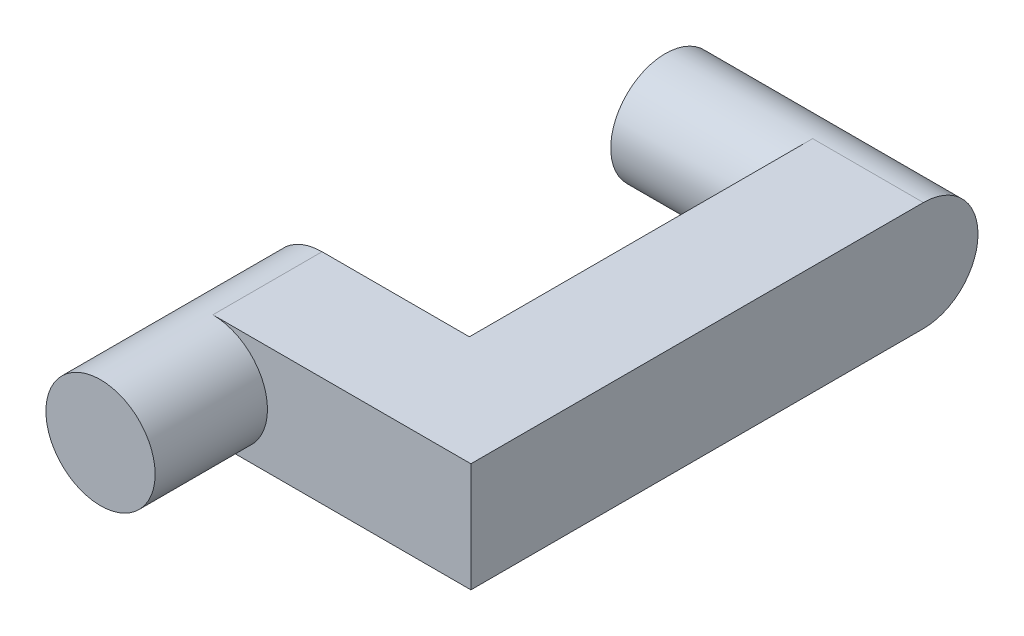
ISO-10303-21;
HEADER;
FILE_DESCRIPTION(('STEP AP214'),'2;1');
FILE_NAME('part.step','',(''),(''),'','','');
FILE_SCHEMA(('AUTOMOTIVE_DESIGN { 1 0 10303 214 1 1 1 1 }'));
ENDSEC;
DATA;
#1=APPLICATION_CONTEXT('core data for automotive mechanical design processes');
#2=APPLICATION_PROTOCOL_DEFINITION('international standard','automotive_design',2000,#1);
#3=PRODUCT_CONTEXT('',#1,'mechanical');
#4=PRODUCT('Part','Part','',(#3));
#5=PRODUCT_RELATED_PRODUCT_CATEGORY('part','',(#4));
#6=PRODUCT_DEFINITION_FORMATION('','',#4);
#7=PRODUCT_DEFINITION_CONTEXT('part definition',#1,'design');
#8=PRODUCT_DEFINITION('design','',#6,#7);
#9=PRODUCT_DEFINITION_SHAPE('','',#8);
#10=(LENGTH_UNIT() NAMED_UNIT(*) SI_UNIT(.MILLI.,.METRE.));
#11=(NAMED_UNIT(*) PLANE_ANGLE_UNIT() SI_UNIT($,.RADIAN.));
#12=(NAMED_UNIT(*) SI_UNIT($,.STERADIAN.) SOLID_ANGLE_UNIT());
#13=UNCERTAINTY_MEASURE_WITH_UNIT(LENGTH_MEASURE(1.E-05),#10,'distance_accuracy_value','');
#14=(GEOMETRIC_REPRESENTATION_CONTEXT(3) GLOBAL_UNCERTAINTY_ASSIGNED_CONTEXT((#13)) GLOBAL_UNIT_ASSIGNED_CONTEXT((#10,
#11,#12)) REPRESENTATION_CONTEXT('',''));
#15=CARTESIAN_POINT('',(0.,0.,0.));
#16=DIRECTION('',(0.,0.,1.));
#17=DIRECTION('',(1.,0.,0.));
#18=AXIS2_PLACEMENT_3D('',#15,#16,#17);
#19=CARTESIAN_POINT('',(0.,17.5,5.50252531694168));
#20=DIRECTION('',(0.,0.,1.));
#21=DIRECTION('',(1.,0.,0.));
#22=AXIS2_PLACEMENT_3D('',#19,#20,#21);
#23=CYLINDRICAL_SURFACE('',#22,17.5);
#24=CARTESIAN_POINT('',(0.,17.5,126.));
#25=DIRECTION('',(0.,0.,1.));
#26=DIRECTION('',(1.,0.,0.));
#27=AXIS2_PLACEMENT_3D('',#24,#25,#26);
#28=CIRCLE('',#27,17.5);
#29=CARTESIAN_POINT('',(17.5,17.5,126.));
#30=VERTEX_POINT('',#29);
#31=EDGE_CURVE('E135',#30,#30,#28,.T.);
#32=ORIENTED_EDGE('',*,*,#31,.F.);
#33=EDGE_LOOP('',(#32));
#34=FACE_BOUND('',#33,.T.);
#35=CARTESIAN_POINT('',(0.,17.5,90.));
#36=DIRECTION('',(0.,0.,-1.));
#37=DIRECTION('',(-1.,0.,0.));
#38=AXIS2_PLACEMENT_3D('',#35,#36,#37);
#39=CIRCLE('',#38,17.5);
#40=CARTESIAN_POINT('',(0.,0.,90.));
#41=VERTEX_POINT('',#40);
#42=CARTESIAN_POINT('',(0.,35.,90.));
#43=VERTEX_POINT('',#42);
#44=EDGE_CURVE('E11',#41,#43,#39,.F.);
#45=ORIENTED_EDGE('',*,*,#44,.T.);
#46=DIRECTION('',(0.,0.,1.));
#47=VECTOR('',#46,1.);
#48=CARTESIAN_POINT('',(0.,35.,90.));
#49=LINE('',#48,#47);
#50=CARTESIAN_POINT('',(0.,35.,55.));
#51=VERTEX_POINT('',#50);
#52=EDGE_CURVE('E126',#51,#43,#49,.T.);
#53=ORIENTED_EDGE('',*,*,#52,.F.);
#54=CARTESIAN_POINT('',(0.,17.5,55.));
#55=DIRECTION('',(0.,0.,1.));
#56=DIRECTION('',(1.,0.,0.));
#57=AXIS2_PLACEMENT_3D('',#54,#55,#56);
#58=CIRCLE('',#57,17.5);
#59=CARTESIAN_POINT('',(0.,0.,55.));
#60=VERTEX_POINT('',#59);
#61=EDGE_CURVE('E48',#60,#51,#58,.F.);
#62=ORIENTED_EDGE('',*,*,#61,.F.);
#63=DIRECTION('',(0.,0.,1.));
#64=VECTOR('',#63,1.);
#65=CARTESIAN_POINT('',(0.,0.,90.));
#66=LINE('',#65,#64);
#67=EDGE_CURVE('E58',#60,#41,#66,.T.);
#68=ORIENTED_EDGE('',*,*,#67,.T.);
#69=EDGE_LOOP('',(#45,#53,#62,#68));
#70=FACE_BOUND('',#69,.T.);
#71=ADVANCED_FACE('F40',(#34,#70),#23,.T.);
#72=CARTESIAN_POINT('',(0.,35.,55.));
#73=DIRECTION('',(0.,0.,1.));
#74=DIRECTION('',(1.,0.,0.));
#75=AXIS2_PLACEMENT_3D('',#72,#73,#74);
#76=PLANE('',#75);
#77=ORIENTED_EDGE('',*,*,#61,.T.);
#78=DIRECTION('',(-1.,0.,0.));
#79=VECTOR('',#78,1.);
#80=CARTESIAN_POINT('',(0.,35.,55.));
#81=LINE('',#80,#79);
#82=CARTESIAN_POINT('',(47.20666681897,35.,55.));
#83=VERTEX_POINT('',#82);
#84=EDGE_CURVE('E131',#83,#51,#81,.T.);
#85=ORIENTED_EDGE('',*,*,#84,.F.);
#86=DIRECTION('',(0.,-1.,0.));
#87=VECTOR('',#86,1.);
#88=CARTESIAN_POINT('',(47.20666681897,35.,55.));
#89=LINE('',#88,#87);
#90=CARTESIAN_POINT('',(47.20666681897,0.,55.));
#91=VERTEX_POINT('',#90);
#92=EDGE_CURVE('E127',#83,#91,#89,.T.);
#93=ORIENTED_EDGE('',*,*,#92,.T.);
#94=DIRECTION('',(-1.,0.,0.));
#95=VECTOR('',#94,1.);
#96=CARTESIAN_POINT('',(0.,0.,55.));
#97=LINE('',#96,#95);
#98=EDGE_CURVE('E97',#91,#60,#97,.T.);
#99=ORIENTED_EDGE('',*,*,#98,.T.);
#100=EDGE_LOOP('',(#77,#85,#93,#99));
#101=FACE_BOUND('',#100,.T.);
#102=ADVANCED_FACE('F143',(#101),#76,.F.);
#103=CARTESIAN_POINT('',(0.,17.5,126.));
#104=DIRECTION('',(0.,0.,1.));
#105=DIRECTION('',(1.,0.,0.));
#106=AXIS2_PLACEMENT_3D('',#103,#104,#105);
#107=PLANE('',#106);
#108=ORIENTED_EDGE('',*,*,#31,.T.);
#109=EDGE_LOOP('',(#108));
#110=FACE_BOUND('',#109,.T.);
#111=ADVANCED_FACE('F190',(#110),#107,.T.);
#112=CARTESIAN_POINT('',(0.,35.,90.));
#113=DIRECTION('',(0.,0.,-1.));
#114=DIRECTION('',(-1.,0.,0.));
#115=AXIS2_PLACEMENT_3D('',#112,#113,#114);
#116=PLANE('',#115);
#117=ORIENTED_EDGE('',*,*,#44,.F.);
#118=DIRECTION('',(1.,0.,0.));
#119=VECTOR('',#118,1.);
#120=CARTESIAN_POINT('',(0.,0.,90.));
#121=LINE('',#120,#119);
#122=CARTESIAN_POINT('',(82.6921327229711,0.,90.));
#123=VERTEX_POINT('',#122);
#124=EDGE_CURVE('E120',#41,#123,#121,.T.);
#125=ORIENTED_EDGE('',*,*,#124,.T.);
#126=DIRECTION('',(0.,-1.,0.));
#127=VECTOR('',#126,1.);
#128=CARTESIAN_POINT('',(82.6921327229711,35.,90.));
#129=LINE('',#128,#127);
#130=CARTESIAN_POINT('',(82.6921327229711,35.,90.));
#131=VERTEX_POINT('',#130);
#132=EDGE_CURVE('E130',#131,#123,#129,.T.);
#133=ORIENTED_EDGE('',*,*,#132,.F.);
#134=DIRECTION('',(1.,0.,0.));
#135=VECTOR('',#134,1.);
#136=CARTESIAN_POINT('',(0.,35.,90.));
#137=LINE('',#136,#135);
#138=EDGE_CURVE('E165',#43,#131,#137,.T.);
#139=ORIENTED_EDGE('',*,*,#138,.F.);
#140=EDGE_LOOP('',(#117,#125,#133,#139));
#141=FACE_BOUND('',#140,.T.);
#142=ADVANCED_FACE('F159',(#141),#116,.F.);
#143=CARTESIAN_POINT('',(82.6921327229711,35.,90.));
#144=DIRECTION('',(-1.,0.,0.));
#145=DIRECTION('',(0.,0.,1.));
#146=AXIS2_PLACEMENT_3D('',#143,#144,#145);
#147=PLANE('',#146);
#148=DIRECTION('',(0.,0.,-1.));
#149=VECTOR('',#148,1.);
#150=CARTESIAN_POINT('',(82.6921327229711,0.,90.));
#151=LINE('',#150,#149);
#152=CARTESIAN_POINT('',(82.6921327229711,0.,-55.));
#153=VERTEX_POINT('',#152);
#154=EDGE_CURVE('E117',#123,#153,#151,.T.);
#155=ORIENTED_EDGE('',*,*,#154,.T.);
#156=CARTESIAN_POINT('',(82.6921327229711,17.5,-55.));
#157=DIRECTION('',(-1.,0.,0.));
#158=DIRECTION('',(0.,0.,1.));
#159=AXIS2_PLACEMENT_3D('',#156,#157,#158);
#160=CIRCLE('',#159,17.5);
#161=CARTESIAN_POINT('',(82.6921327229711,35.,-55.));
#162=VERTEX_POINT('',#161);
#163=EDGE_CURVE('E115',#153,#162,#160,.F.);
#164=ORIENTED_EDGE('',*,*,#163,.T.);
#165=DIRECTION('',(0.,0.,-1.));
#166=VECTOR('',#165,1.);
#167=CARTESIAN_POINT('',(82.6921327229711,35.,90.));
#168=LINE('',#167,#166);
#169=EDGE_CURVE('E163',#131,#162,#168,.T.);
#170=ORIENTED_EDGE('',*,*,#169,.F.);
#171=ORIENTED_EDGE('',*,*,#132,.T.);
#172=EDGE_LOOP('',(#155,#164,#170,#171));
#173=FACE_BOUND('',#172,.T.);
#174=ADVANCED_FACE('F162',(#173),#147,.F.);
#175=CARTESIAN_POINT('',(47.20666681897,35.,55.));
#176=DIRECTION('',(1.,0.,0.));
#177=DIRECTION('',(0.,0.,-1.));
#178=AXIS2_PLACEMENT_3D('',#175,#176,#177);
#179=PLANE('',#178);
#180=CARTESIAN_POINT('',(47.20666681897,17.5,-55.));
#181=DIRECTION('',(1.,0.,0.));
#182=DIRECTION('',(0.,0.,-1.));
#183=AXIS2_PLACEMENT_3D('',#180,#181,#182);
#184=CIRCLE('',#183,17.5);
#185=CARTESIAN_POINT('',(47.20666681897,0.,-55.));
#186=VERTEX_POINT('',#185);
#187=CARTESIAN_POINT('',(47.20666681897,35.,-55.));
#188=VERTEX_POINT('',#187);
#189=EDGE_CURVE('E105',#186,#188,#184,.F.);
#190=ORIENTED_EDGE('',*,*,#189,.F.);
#191=DIRECTION('',(0.,0.,1.));
#192=VECTOR('',#191,1.);
#193=CARTESIAN_POINT('',(47.20666681897,0.,55.));
#194=LINE('',#193,#192);
#195=EDGE_CURVE('E89',#186,#91,#194,.T.);
#196=ORIENTED_EDGE('',*,*,#195,.T.);
#197=ORIENTED_EDGE('',*,*,#92,.F.);
#198=DIRECTION('',(0.,0.,1.));
#199=VECTOR('',#198,1.);
#200=CARTESIAN_POINT('',(47.20666681897,35.,55.));
#201=LINE('',#200,#199);
#202=EDGE_CURVE('E107',#188,#83,#201,.T.);
#203=ORIENTED_EDGE('',*,*,#202,.F.);
#204=EDGE_LOOP('',(#190,#196,#197,#203));
#205=FACE_BOUND('',#204,.T.);
#206=ADVANCED_FACE('F106',(#205),#179,.F.);
#207=CARTESIAN_POINT('',(0.,35.,0.));
#208=DIRECTION('',(0.,-1.,0.));
#209=DIRECTION('',(0.,0.,-1.));
#210=AXIS2_PLACEMENT_3D('',#207,#208,#209);
#211=PLANE('',#210);
#212=ORIENTED_EDGE('',*,*,#52,.T.);
#213=ORIENTED_EDGE('',*,*,#138,.T.);
#214=ORIENTED_EDGE('',*,*,#169,.T.);
#215=DIRECTION('',(-1.,0.,0.));
#216=VECTOR('',#215,1.);
#217=CARTESIAN_POINT('',(47.20666681897,35.,-55.));
#218=LINE('',#217,#216);
#219=EDGE_CURVE('E150',#162,#188,#218,.T.);
#220=ORIENTED_EDGE('',*,*,#219,.T.);
#221=ORIENTED_EDGE('',*,*,#202,.T.);
#222=ORIENTED_EDGE('',*,*,#84,.T.);
#223=EDGE_LOOP('',(#212,#213,#214,#220,#221,#222));
#224=FACE_BOUND('',#223,.T.);
#225=ADVANCED_FACE('F146',(#224),#211,.F.);
#226=CARTESIAN_POINT('',(0.,0.,0.));
#227=DIRECTION('',(0.,-1.,0.));
#228=DIRECTION('',(0.,0.,-1.));
#229=AXIS2_PLACEMENT_3D('',#226,#227,#228);
#230=PLANE('',#229);
#231=ORIENTED_EDGE('',*,*,#67,.F.);
#232=ORIENTED_EDGE('',*,*,#98,.F.);
#233=ORIENTED_EDGE('',*,*,#195,.F.);
#234=DIRECTION('',(-1.,0.,0.));
#235=VECTOR('',#234,1.);
#236=CARTESIAN_POINT('',(47.20666681897,0.,-55.));
#237=LINE('',#236,#235);
#238=EDGE_CURVE('E94',#153,#186,#237,.T.);
#239=ORIENTED_EDGE('',*,*,#238,.F.);
#240=ORIENTED_EDGE('',*,*,#154,.F.);
#241=ORIENTED_EDGE('',*,*,#124,.F.);
#242=EDGE_LOOP('',(#231,#232,#233,#239,#240,#241));
#243=FACE_BOUND('',#242,.T.);
#244=ADVANCED_FACE('F91',(#243),#230,.T.);
#245=CARTESIAN_POINT('',(-49.4974746830583,17.5,-55.));
#246=DIRECTION('',(1.,0.,0.));
#247=DIRECTION('',(0.,0.,-1.));
#248=AXIS2_PLACEMENT_3D('',#245,#246,#247);
#249=CYLINDRICAL_SURFACE('',#248,17.5);
#250=CARTESIAN_POINT('',(0.,17.5,-55.));
#251=DIRECTION('',(1.,0.,0.));
#252=DIRECTION('',(0.,0.,-1.));
#253=AXIS2_PLACEMENT_3D('',#250,#251,#252);
#254=CIRCLE('',#253,17.5);
#255=CARTESIAN_POINT('',(0.,17.5,-72.5));
#256=VERTEX_POINT('',#255);
#257=EDGE_CURVE('E111',#256,#256,#254,.T.);
#258=ORIENTED_EDGE('',*,*,#257,.T.);
#259=EDGE_LOOP('',(#258));
#260=FACE_BOUND('',#259,.T.);
#261=ORIENTED_EDGE('',*,*,#189,.T.);
#262=ORIENTED_EDGE('',*,*,#219,.F.);
#263=ORIENTED_EDGE('',*,*,#163,.F.);
#264=ORIENTED_EDGE('',*,*,#238,.T.);
#265=EDGE_LOOP('',(#261,#262,#263,#264));
#266=FACE_BOUND('',#265,.T.);
#267=ADVANCED_FACE('F113',(#260,#266),#249,.T.);
#268=CARTESIAN_POINT('',(0.,35.,90.));
#269=DIRECTION('',(1.,0.,0.));
#270=DIRECTION('',(0.,0.,-1.));
#271=AXIS2_PLACEMENT_3D('',#268,#269,#270);
#272=PLANE('',#271);
#273=ORIENTED_EDGE('',*,*,#257,.F.);
#274=EDGE_LOOP('',(#273));
#275=FACE_BOUND('',#274,.T.);
#276=ADVANCED_FACE('F180',(#275),#272,.F.);
#277=CLOSED_SHELL('',(#71,#102,#111,#142,#174,#206,#225,#244,#267,#276));
#278=MANIFOLD_SOLID_BREP('B2',#277);
#279=ADVANCED_BREP_SHAPE_REPRESENTATION('',(#18,#278),#14);
#280=SHAPE_DEFINITION_REPRESENTATION(#9,#279);
ENDSEC;
END-ISO-10303-21;
